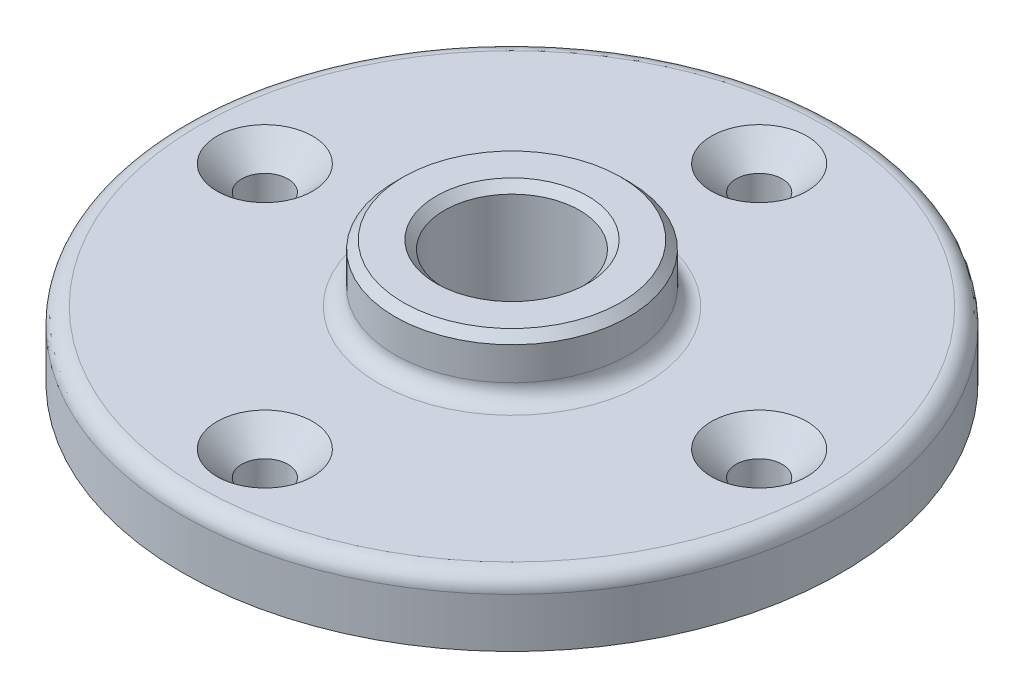
ISO-10303-21;
HEADER;
FILE_DESCRIPTION(('STEP AP214'),'2;1');
FILE_NAME('part.step','',(''),(''),'','','');
FILE_SCHEMA(('AUTOMOTIVE_DESIGN { 1 0 10303 214 1 1 1 1 }'));
ENDSEC;
DATA;
#1=APPLICATION_CONTEXT('core data for automotive mechanical design processes');
#2=APPLICATION_PROTOCOL_DEFINITION('international standard','automotive_design',2000,#1);
#3=PRODUCT_CONTEXT('',#1,'mechanical');
#4=PRODUCT('Part','Part','',(#3));
#5=PRODUCT_RELATED_PRODUCT_CATEGORY('part','',(#4));
#6=PRODUCT_DEFINITION_FORMATION('','',#4);
#7=PRODUCT_DEFINITION_CONTEXT('part definition',#1,'design');
#8=PRODUCT_DEFINITION('design','',#6,#7);
#9=PRODUCT_DEFINITION_SHAPE('','',#8);
#10=(LENGTH_UNIT() NAMED_UNIT(*) SI_UNIT(.MILLI.,.METRE.));
#11=(NAMED_UNIT(*) PLANE_ANGLE_UNIT() SI_UNIT($,.RADIAN.));
#12=(NAMED_UNIT(*) SI_UNIT($,.STERADIAN.) SOLID_ANGLE_UNIT());
#13=UNCERTAINTY_MEASURE_WITH_UNIT(LENGTH_MEASURE(1.E-05),#10,'distance_accuracy_value','');
#14=(GEOMETRIC_REPRESENTATION_CONTEXT(3) GLOBAL_UNCERTAINTY_ASSIGNED_CONTEXT((#13)) GLOBAL_UNIT_ASSIGNED_CONTEXT((#10,
#11,#12)) REPRESENTATION_CONTEXT('',''));
#15=CARTESIAN_POINT('',(0.,0.,0.));
#16=DIRECTION('',(0.,0.,1.));
#17=DIRECTION('',(1.,0.,0.));
#18=AXIS2_PLACEMENT_3D('',#15,#16,#17);
#19=CARTESIAN_POINT('',(0.,4.,0.));
#20=DIRECTION('',(0.,1.,0.));
#21=DIRECTION('',(0.,0.,1.));
#22=AXIS2_PLACEMENT_3D('',#19,#20,#21);
#23=PLANE('',#22);
#24=CARTESIAN_POINT('',(0.,4.,0.));
#25=DIRECTION('',(0.,1.,0.));
#26=DIRECTION('',(0.,0.,1.));
#27=AXIS2_PLACEMENT_3D('',#24,#25,#26);
#28=CIRCLE('',#27,8.1);
#29=CARTESIAN_POINT('',(0.,4.,8.1));
#30=VERTEX_POINT('',#29);
#31=EDGE_CURVE('E53',#30,#30,#28,.F.);
#32=ORIENTED_EDGE('',*,*,#31,.T.);
#33=EDGE_LOOP('',(#32));
#34=FACE_BOUND('',#33,.T.);
#35=CARTESIAN_POINT('',(0.,4.,-15.));
#36=DIRECTION('',(0.,1.,0.));
#37=DIRECTION('',(0.,0.,1.));
#38=AXIS2_PLACEMENT_3D('',#35,#36,#37);
#39=CIRCLE('',#38,2.90000000000001);
#40=CARTESIAN_POINT('',(0.,4.,-12.1));
#41=VERTEX_POINT('',#40);
#42=EDGE_CURVE('E104',#41,#41,#39,.F.);
#43=ORIENTED_EDGE('',*,*,#42,.T.);
#44=EDGE_LOOP('',(#43));
#45=FACE_BOUND('',#44,.T.);
#46=CARTESIAN_POINT('',(-15.,4.,0.));
#47=DIRECTION('',(0.,1.,0.));
#48=DIRECTION('',(0.,0.,1.));
#49=AXIS2_PLACEMENT_3D('',#46,#47,#48);
#50=CIRCLE('',#49,2.90000000000001);
#51=CARTESIAN_POINT('',(-15.,4.,2.90000000000006));
#52=VERTEX_POINT('',#51);
#53=EDGE_CURVE('E96',#52,#52,#50,.F.);
#54=ORIENTED_EDGE('',*,*,#53,.T.);
#55=EDGE_LOOP('',(#54));
#56=FACE_BOUND('',#55,.T.);
#57=CARTESIAN_POINT('',(0.,4.,15.));
#58=DIRECTION('',(0.,1.,0.));
#59=DIRECTION('',(0.,0.,1.));
#60=AXIS2_PLACEMENT_3D('',#57,#58,#59);
#61=CIRCLE('',#60,2.90000000000001);
#62=CARTESIAN_POINT('',(0.,4.,17.9));
#63=VERTEX_POINT('',#62);
#64=EDGE_CURVE('E88',#63,#63,#61,.F.);
#65=ORIENTED_EDGE('',*,*,#64,.T.);
#66=EDGE_LOOP('',(#65));
#67=FACE_BOUND('',#66,.T.);
#68=CARTESIAN_POINT('',(15.,4.,-1.57116660247941E-13));
#69=DIRECTION('',(0.,1.,0.));
#70=DIRECTION('',(0.,0.,1.));
#71=AXIS2_PLACEMENT_3D('',#68,#69,#70);
#72=CIRCLE('',#71,2.90000000000001);
#73=CARTESIAN_POINT('',(15.,4.,2.89999999999985));
#74=VERTEX_POINT('',#73);
#75=EDGE_CURVE('E80',#74,#74,#72,.F.);
#76=ORIENTED_EDGE('',*,*,#75,.T.);
#77=EDGE_LOOP('',(#76));
#78=FACE_BOUND('',#77,.T.);
#79=CARTESIAN_POINT('',(0.,4.,0.));
#80=DIRECTION('',(0.,1.,0.));
#81=DIRECTION('',(0.,0.,1.));
#82=AXIS2_PLACEMENT_3D('',#79,#80,#81);
#83=CIRCLE('',#82,19.);
#84=CARTESIAN_POINT('',(0.,4.,19.));
#85=VERTEX_POINT('',#84);
#86=EDGE_CURVE('E76',#85,#85,#83,.T.);
#87=ORIENTED_EDGE('',*,*,#86,.T.);
#88=EDGE_LOOP('',(#87));
#89=FACE_BOUND('',#88,.T.);
#90=ADVANCED_FACE('F39',(#34,#45,#56,#67,#78,#89),#23,.T.);
#91=CARTESIAN_POINT('',(0.,4.,0.));
#92=DIRECTION('',(0.,-1.,0.));
#93=DIRECTION('',(0.,0.,-1.));
#94=AXIS2_PLACEMENT_3D('',#91,#92,#93);
#95=CYLINDRICAL_SURFACE('',#94,20.);
#96=CARTESIAN_POINT('',(0.,3.,0.));
#97=DIRECTION('',(0.,1.,0.));
#98=DIRECTION('',(0.,0.,1.));
#99=AXIS2_PLACEMENT_3D('',#96,#97,#98);
#100=CIRCLE('',#99,20.);
#101=CARTESIAN_POINT('',(0.,3.,20.));
#102=VERTEX_POINT('',#101);
#103=EDGE_CURVE('E72',#102,#102,#100,.F.);
#104=ORIENTED_EDGE('',*,*,#103,.T.);
#105=EDGE_LOOP('',(#104));
#106=FACE_BOUND('',#105,.T.);
#107=CARTESIAN_POINT('',(0.,0.,0.));
#108=DIRECTION('',(0.,1.,0.));
#109=DIRECTION('',(0.,0.,1.));
#110=AXIS2_PLACEMENT_3D('',#107,#108,#109);
#111=CIRCLE('',#110,20.);
#112=CARTESIAN_POINT('',(0.,0.,20.));
#113=VERTEX_POINT('',#112);
#114=EDGE_CURVE('E112',#113,#113,#111,.T.);
#115=ORIENTED_EDGE('',*,*,#114,.T.);
#116=EDGE_LOOP('',(#115));
#117=FACE_BOUND('',#116,.T.);
#118=ADVANCED_FACE('F158',(#106,#117),#95,.T.);
#119=CARTESIAN_POINT('',(0.,0.,0.));
#120=DIRECTION('',(0.,1.,0.));
#121=DIRECTION('',(0.,0.,1.));
#122=AXIS2_PLACEMENT_3D('',#119,#120,#121);
#123=PLANE('',#122);
#124=CARTESIAN_POINT('',(-15.,0.,0.));
#125=DIRECTION('',(0.,1.,0.));
#126=DIRECTION('',(1.,0.,0.));
#127=AXIS2_PLACEMENT_3D('',#124,#125,#126);
#128=CIRCLE('',#127,1.4);
#129=CARTESIAN_POINT('',(-13.6,0.,0.));
#130=VERTEX_POINT('',#129);
#131=EDGE_CURVE('E124',#130,#130,#128,.T.);
#132=ORIENTED_EDGE('',*,*,#131,.T.);
#133=EDGE_LOOP('',(#132));
#134=FACE_BOUND('',#133,.T.);
#135=CARTESIAN_POINT('',(0.,0.,15.));
#136=DIRECTION('',(0.,1.,0.));
#137=DIRECTION('',(0.,0.,-1.));
#138=AXIS2_PLACEMENT_3D('',#135,#136,#137);
#139=CIRCLE('',#138,1.4);
#140=CARTESIAN_POINT('',(0.,0.,13.6));
#141=VERTEX_POINT('',#140);
#142=EDGE_CURVE('E129',#141,#141,#139,.T.);
#143=ORIENTED_EDGE('',*,*,#142,.T.);
#144=EDGE_LOOP('',(#143));
#145=FACE_BOUND('',#144,.T.);
#146=CARTESIAN_POINT('',(15.,0.,-1.57116660247941E-13));
#147=DIRECTION('',(0.,1.,0.));
#148=DIRECTION('',(-1.,0.,0.));
#149=AXIS2_PLACEMENT_3D('',#146,#147,#148);
#150=CIRCLE('',#149,1.4);
#151=CARTESIAN_POINT('',(13.6,0.,-1.424524386248E-13));
#152=VERTEX_POINT('',#151);
#153=EDGE_CURVE('E125',#152,#152,#150,.T.);
#154=ORIENTED_EDGE('',*,*,#153,.T.);
#155=EDGE_LOOP('',(#154));
#156=FACE_BOUND('',#155,.T.);
#157=CARTESIAN_POINT('',(0.,0.,-15.));
#158=DIRECTION('',(0.,1.,0.));
#159=DIRECTION('',(0.,0.,1.));
#160=AXIS2_PLACEMENT_3D('',#157,#158,#159);
#161=CIRCLE('',#160,1.4);
#162=CARTESIAN_POINT('',(0.,0.,-13.6));
#163=VERTEX_POINT('',#162);
#164=EDGE_CURVE('E120',#163,#163,#161,.T.);
#165=ORIENTED_EDGE('',*,*,#164,.T.);
#166=EDGE_LOOP('',(#165));
#167=FACE_BOUND('',#166,.T.);
#168=CARTESIAN_POINT('',(0.,0.,0.));
#169=DIRECTION('',(0.,1.,0.));
#170=DIRECTION('',(0.,0.,1.));
#171=AXIS2_PLACEMENT_3D('',#168,#169,#170);
#172=CIRCLE('',#171,4.1);
#173=CARTESIAN_POINT('',(0.,0.,4.1));
#174=VERTEX_POINT('',#173);
#175=EDGE_CURVE('E116',#174,#174,#172,.T.);
#176=ORIENTED_EDGE('',*,*,#175,.T.);
#177=EDGE_LOOP('',(#176));
#178=FACE_BOUND('',#177,.T.);
#179=ORIENTED_EDGE('',*,*,#114,.F.);
#180=EDGE_LOOP('',(#179));
#181=FACE_BOUND('',#180,.T.);
#182=ADVANCED_FACE('F137',(#134,#145,#156,#167,#178,#181),#123,.F.);
#183=CARTESIAN_POINT('',(0.,0.,0.));
#184=DIRECTION('',(0.,1.,0.));
#185=DIRECTION('',(0.,0.,1.));
#186=AXIS2_PLACEMENT_3D('',#183,#184,#185);
#187=CYLINDRICAL_SURFACE('',#186,4.1);
#188=CARTESIAN_POINT('',(0.,7.,0.));
#189=DIRECTION('',(0.,1.,0.));
#190=DIRECTION('',(0.,0.,1.));
#191=AXIS2_PLACEMENT_3D('',#188,#189,#190);
#192=CIRCLE('',#191,4.1);
#193=CARTESIAN_POINT('',(0.,7.,4.1));
#194=VERTEX_POINT('',#193);
#195=EDGE_CURVE('E68',#194,#194,#192,.T.);
#196=ORIENTED_EDGE('',*,*,#195,.T.);
#197=EDGE_LOOP('',(#196));
#198=FACE_BOUND('',#197,.T.);
#199=ORIENTED_EDGE('',*,*,#175,.F.);
#200=EDGE_LOOP('',(#199));
#201=FACE_BOUND('',#200,.T.);
#202=ADVANCED_FACE('F169',(#198,#201),#187,.F.);
#203=CARTESIAN_POINT('',(0.,0.,-15.));
#204=DIRECTION('',(0.,1.,0.));
#205=DIRECTION('',(0.,0.,1.));
#206=AXIS2_PLACEMENT_3D('',#203,#204,#205);
#207=CYLINDRICAL_SURFACE('',#206,1.4);
#208=CARTESIAN_POINT('',(0.,2.5,-15.));
#209=DIRECTION('',(0.,1.,0.));
#210=DIRECTION('',(0.,0.,1.));
#211=AXIS2_PLACEMENT_3D('',#208,#209,#210);
#212=CIRCLE('',#211,1.4);
#213=CARTESIAN_POINT('',(0.,2.5,-13.6));
#214=VERTEX_POINT('',#213);
#215=EDGE_CURVE('E108',#214,#214,#212,.T.);
#216=ORIENTED_EDGE('',*,*,#215,.T.);
#217=EDGE_LOOP('',(#216));
#218=FACE_BOUND('',#217,.T.);
#219=ORIENTED_EDGE('',*,*,#164,.F.);
#220=EDGE_LOOP('',(#219));
#221=FACE_BOUND('',#220,.T.);
#222=ADVANCED_FACE('F179',(#218,#221),#207,.F.);
#223=CARTESIAN_POINT('',(0.,2.5,-15.));
#224=DIRECTION('',(0.,1.,0.));
#225=DIRECTION('',(0.,0.,1.));
#226=AXIS2_PLACEMENT_3D('',#223,#224,#225);
#227=CONICAL_SURFACE('',#226,1.4,0.785398163397449);
#228=ORIENTED_EDGE('',*,*,#42,.F.);
#229=EDGE_LOOP('',(#228));
#230=FACE_BOUND('',#229,.T.);
#231=ORIENTED_EDGE('',*,*,#215,.F.);
#232=EDGE_LOOP('',(#231));
#233=FACE_BOUND('',#232,.T.);
#234=ADVANCED_FACE('F174',(#230,#233),#227,.F.);
#235=CARTESIAN_POINT('',(15.,0.,-1.57116660247941E-13));
#236=DIRECTION('',(0.,1.,0.));
#237=DIRECTION('',(0.,0.,1.));
#238=AXIS2_PLACEMENT_3D('',#235,#236,#237);
#239=CYLINDRICAL_SURFACE('',#238,1.4);
#240=CARTESIAN_POINT('',(15.,2.5,-1.57116660247941E-13));
#241=DIRECTION('',(0.,1.,0.));
#242=DIRECTION('',(0.,0.,1.));
#243=AXIS2_PLACEMENT_3D('',#240,#241,#242);
#244=CIRCLE('',#243,1.4);
#245=CARTESIAN_POINT('',(15.,2.5,1.39999999999984));
#246=VERTEX_POINT('',#245);
#247=EDGE_CURVE('E84',#246,#246,#244,.T.);
#248=ORIENTED_EDGE('',*,*,#247,.T.);
#249=EDGE_LOOP('',(#248));
#250=FACE_BOUND('',#249,.T.);
#251=ORIENTED_EDGE('',*,*,#153,.F.);
#252=EDGE_LOOP('',(#251));
#253=FACE_BOUND('',#252,.T.);
#254=ADVANCED_FACE('F153',(#250,#253),#239,.F.);
#255=CARTESIAN_POINT('',(0.,0.,15.));
#256=DIRECTION('',(0.,1.,0.));
#257=DIRECTION('',(0.,0.,1.));
#258=AXIS2_PLACEMENT_3D('',#255,#256,#257);
#259=CYLINDRICAL_SURFACE('',#258,1.4);
#260=CARTESIAN_POINT('',(0.,2.5,15.));
#261=DIRECTION('',(0.,1.,0.));
#262=DIRECTION('',(0.,0.,1.));
#263=AXIS2_PLACEMENT_3D('',#260,#261,#262);
#264=CIRCLE('',#263,1.4);
#265=CARTESIAN_POINT('',(0.,2.5,16.4));
#266=VERTEX_POINT('',#265);
#267=EDGE_CURVE('E92',#266,#266,#264,.T.);
#268=ORIENTED_EDGE('',*,*,#267,.T.);
#269=EDGE_LOOP('',(#268));
#270=FACE_BOUND('',#269,.T.);
#271=ORIENTED_EDGE('',*,*,#142,.F.);
#272=EDGE_LOOP('',(#271));
#273=FACE_BOUND('',#272,.T.);
#274=ADVANCED_FACE('F143',(#270,#273),#259,.F.);
#275=CARTESIAN_POINT('',(-15.,0.,0.));
#276=DIRECTION('',(0.,1.,0.));
#277=DIRECTION('',(0.,0.,1.));
#278=AXIS2_PLACEMENT_3D('',#275,#276,#277);
#279=CYLINDRICAL_SURFACE('',#278,1.4);
#280=CARTESIAN_POINT('',(-15.,2.5,0.));
#281=DIRECTION('',(0.,1.,0.));
#282=DIRECTION('',(0.,0.,1.));
#283=AXIS2_PLACEMENT_3D('',#280,#281,#282);
#284=CIRCLE('',#283,1.4);
#285=CARTESIAN_POINT('',(-15.,2.5,1.40000000000005));
#286=VERTEX_POINT('',#285);
#287=EDGE_CURVE('E100',#286,#286,#284,.T.);
#288=ORIENTED_EDGE('',*,*,#287,.T.);
#289=EDGE_LOOP('',(#288));
#290=FACE_BOUND('',#289,.T.);
#291=ORIENTED_EDGE('',*,*,#131,.F.);
#292=EDGE_LOOP('',(#291));
#293=FACE_BOUND('',#292,.T.);
#294=ADVANCED_FACE('F140',(#290,#293),#279,.F.);
#295=CARTESIAN_POINT('',(-15.,2.5,0.));
#296=DIRECTION('',(0.,1.,0.));
#297=DIRECTION('',(0.,0.,1.));
#298=AXIS2_PLACEMENT_3D('',#295,#296,#297);
#299=CONICAL_SURFACE('',#298,1.4,0.785398163397449);
#300=ORIENTED_EDGE('',*,*,#53,.F.);
#301=EDGE_LOOP('',(#300));
#302=FACE_BOUND('',#301,.T.);
#303=ORIENTED_EDGE('',*,*,#287,.F.);
#304=EDGE_LOOP('',(#303));
#305=FACE_BOUND('',#304,.T.);
#306=ADVANCED_FACE('F142',(#302,#305),#299,.F.);
#307=CARTESIAN_POINT('',(0.,2.5,15.));
#308=DIRECTION('',(0.,1.,0.));
#309=DIRECTION('',(0.,0.,1.));
#310=AXIS2_PLACEMENT_3D('',#307,#308,#309);
#311=CONICAL_SURFACE('',#310,1.4,0.785398163397449);
#312=ORIENTED_EDGE('',*,*,#64,.F.);
#313=EDGE_LOOP('',(#312));
#314=FACE_BOUND('',#313,.T.);
#315=ORIENTED_EDGE('',*,*,#267,.F.);
#316=EDGE_LOOP('',(#315));
#317=FACE_BOUND('',#316,.T.);
#318=ADVANCED_FACE('F150',(#314,#317),#311,.F.);
#319=CARTESIAN_POINT('',(15.,2.5,-1.57116660247941E-13));
#320=DIRECTION('',(0.,1.,0.));
#321=DIRECTION('',(0.,0.,1.));
#322=AXIS2_PLACEMENT_3D('',#319,#320,#321);
#323=CONICAL_SURFACE('',#322,1.4,0.785398163397449);
#324=ORIENTED_EDGE('',*,*,#75,.F.);
#325=EDGE_LOOP('',(#324));
#326=FACE_BOUND('',#325,.T.);
#327=ORIENTED_EDGE('',*,*,#247,.F.);
#328=EDGE_LOOP('',(#327));
#329=FACE_BOUND('',#328,.T.);
#330=ADVANCED_FACE('F190',(#326,#329),#323,.F.);
#331=CARTESIAN_POINT('',(0.,3.,0.));
#332=DIRECTION('',(0.,1.,0.));
#333=DIRECTION('',(0.,0.,1.));
#334=AXIS2_PLACEMENT_3D('',#331,#332,#333);
#335=TOROIDAL_SURFACE('',#334,19.,1.);
#336=ORIENTED_EDGE('',*,*,#103,.F.);
#337=EDGE_LOOP('',(#336));
#338=FACE_BOUND('',#337,.T.);
#339=ORIENTED_EDGE('',*,*,#86,.F.);
#340=EDGE_LOOP('',(#339));
#341=FACE_BOUND('',#340,.T.);
#342=ADVANCED_FACE('F197',(#338,#341),#335,.T.);
#343=CARTESIAN_POINT('',(0.,7.5,0.));
#344=DIRECTION('',(0.,1.,0.));
#345=DIRECTION('',(0.,0.,1.));
#346=AXIS2_PLACEMENT_3D('',#343,#344,#345);
#347=PLANE('',#346);
#348=CARTESIAN_POINT('',(0.,7.5,0.));
#349=DIRECTION('',(0.,1.,0.));
#350=DIRECTION('',(0.,0.,1.));
#351=AXIS2_PLACEMENT_3D('',#348,#349,#350);
#352=CIRCLE('',#351,6.59999999999999);
#353=CARTESIAN_POINT('',(0.,7.5,6.59999999999999));
#354=VERTEX_POINT('',#353);
#355=EDGE_CURVE('E48',#354,#354,#352,.T.);
#356=ORIENTED_EDGE('',*,*,#355,.T.);
#357=EDGE_LOOP('',(#356));
#358=FACE_BOUND('',#357,.T.);
#359=CARTESIAN_POINT('',(0.,7.5,0.));
#360=DIRECTION('',(0.,1.,0.));
#361=DIRECTION('',(0.,0.,1.));
#362=AXIS2_PLACEMENT_3D('',#359,#360,#361);
#363=CIRCLE('',#362,4.6);
#364=CARTESIAN_POINT('',(0.,7.5,4.6));
#365=VERTEX_POINT('',#364);
#366=EDGE_CURVE('E64',#365,#365,#363,.F.);
#367=ORIENTED_EDGE('',*,*,#366,.T.);
#368=EDGE_LOOP('',(#367));
#369=FACE_BOUND('',#368,.T.);
#370=ADVANCED_FACE('F201',(#358,#369),#347,.T.);
#371=CARTESIAN_POINT('',(0.,7.5,0.));
#372=DIRECTION('',(0.,-1.,0.));
#373=DIRECTION('',(0.,0.,-1.));
#374=AXIS2_PLACEMENT_3D('',#371,#372,#373);
#375=CYLINDRICAL_SURFACE('',#374,7.1);
#376=CARTESIAN_POINT('',(0.,6.99999999999999,0.));
#377=DIRECTION('',(0.,1.,0.));
#378=DIRECTION('',(0.,0.,1.));
#379=AXIS2_PLACEMENT_3D('',#376,#377,#378);
#380=CIRCLE('',#379,7.1);
#381=CARTESIAN_POINT('',(0.,6.99999999999999,7.1));
#382=VERTEX_POINT('',#381);
#383=EDGE_CURVE('E10',#382,#382,#380,.F.);
#384=ORIENTED_EDGE('',*,*,#383,.T.);
#385=EDGE_LOOP('',(#384));
#386=FACE_BOUND('',#385,.T.);
#387=CARTESIAN_POINT('',(0.,5.,0.));
#388=DIRECTION('',(0.,1.,0.));
#389=DIRECTION('',(0.,0.,1.));
#390=AXIS2_PLACEMENT_3D('',#387,#388,#389);
#391=CIRCLE('',#390,7.1);
#392=CARTESIAN_POINT('',(0.,5.,7.1));
#393=VERTEX_POINT('',#392);
#394=EDGE_CURVE('E58',#393,#393,#391,.T.);
#395=ORIENTED_EDGE('',*,*,#394,.T.);
#396=EDGE_LOOP('',(#395));
#397=FACE_BOUND('',#396,.T.);
#398=ADVANCED_FACE('F208',(#386,#397),#375,.T.);
#399=CARTESIAN_POINT('',(0.,7.,0.));
#400=DIRECTION('',(0.,1.,0.));
#401=DIRECTION('',(0.,0.,1.));
#402=AXIS2_PLACEMENT_3D('',#399,#400,#401);
#403=CONICAL_SURFACE('',#402,4.1,0.785398163397448);
#404=ORIENTED_EDGE('',*,*,#366,.F.);
#405=EDGE_LOOP('',(#404));
#406=FACE_BOUND('',#405,.T.);
#407=ORIENTED_EDGE('',*,*,#195,.F.);
#408=EDGE_LOOP('',(#407));
#409=FACE_BOUND('',#408,.T.);
#410=ADVANCED_FACE('F203',(#406,#409),#403,.F.);
#411=CARTESIAN_POINT('',(0.,5.,0.));
#412=DIRECTION('',(0.,1.,0.));
#413=DIRECTION('',(0.,0.,1.));
#414=AXIS2_PLACEMENT_3D('',#411,#412,#413);
#415=TOROIDAL_SURFACE('',#414,8.1,1.);
#416=ORIENTED_EDGE('',*,*,#31,.F.);
#417=EDGE_LOOP('',(#416));
#418=FACE_BOUND('',#417,.T.);
#419=ORIENTED_EDGE('',*,*,#394,.F.);
#420=EDGE_LOOP('',(#419));
#421=FACE_BOUND('',#420,.T.);
#422=ADVANCED_FACE('F207',(#418,#421),#415,.F.);
#423=CARTESIAN_POINT('',(0.,7.5,0.));
#424=DIRECTION('',(0.,-1.,0.));
#425=DIRECTION('',(0.,0.,-1.));
#426=AXIS2_PLACEMENT_3D('',#423,#424,#425);
#427=CONICAL_SURFACE('',#426,6.59999999999999,0.785398163397445);
#428=ORIENTED_EDGE('',*,*,#383,.F.);
#429=EDGE_LOOP('',(#428));
#430=FACE_BOUND('',#429,.T.);
#431=ORIENTED_EDGE('',*,*,#355,.F.);
#432=EDGE_LOOP('',(#431));
#433=FACE_BOUND('',#432,.T.);
#434=ADVANCED_FACE('F42',(#430,#433),#427,.T.);
#435=CLOSED_SHELL('',(#90,#118,#182,#202,#222,#234,#254,#274,#294,#306,#318,#330,#342,#370,#398,
#410,#422,#434));
#436=MANIFOLD_SOLID_BREP('B2',#435);
#437=ADVANCED_BREP_SHAPE_REPRESENTATION('',(#18,#436),#14);
#438=SHAPE_DEFINITION_REPRESENTATION(#9,#437);
ENDSEC;
END-ISO-10303-21;
